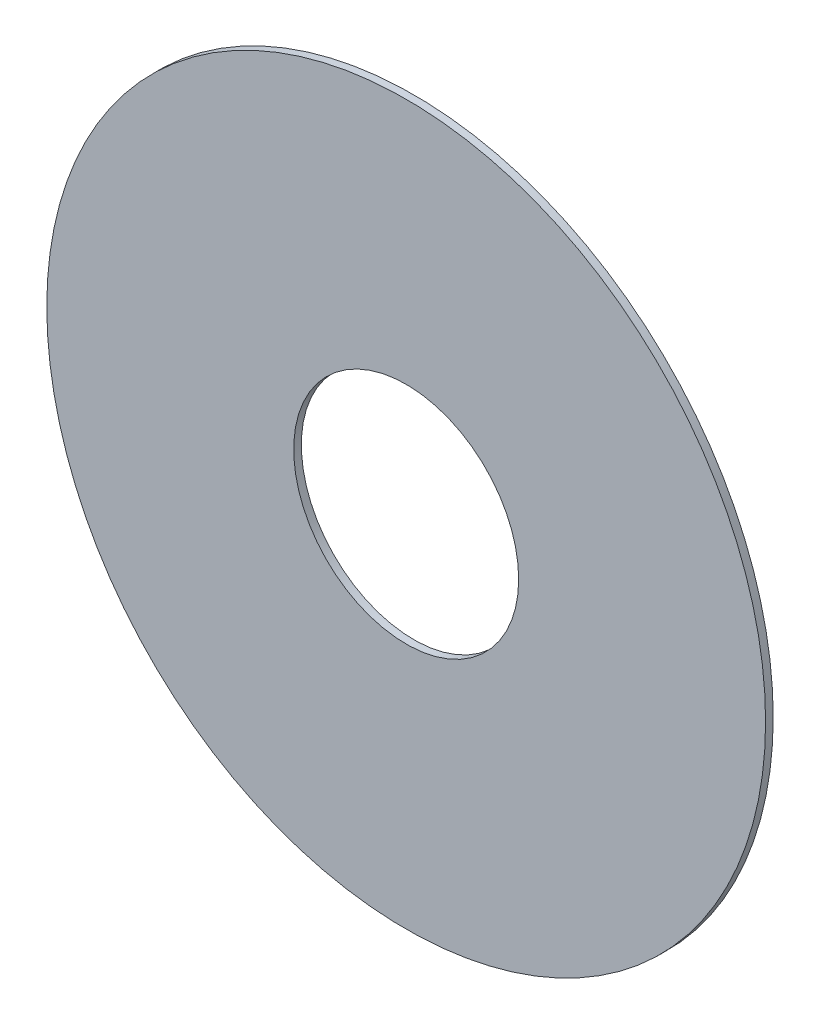
ISO-10303-21;
HEADER;
FILE_DESCRIPTION(('STEP AP214'),'2;1');
FILE_NAME('part.step','',(''),(''),'','','');
FILE_SCHEMA(('AUTOMOTIVE_DESIGN { 1 0 10303 214 1 1 1 1 }'));
ENDSEC;
DATA;
#1=APPLICATION_CONTEXT('core data for automotive mechanical design processes');
#2=APPLICATION_PROTOCOL_DEFINITION('international standard','automotive_design',2000,#1);
#3=PRODUCT_CONTEXT('',#1,'mechanical');
#4=PRODUCT('Part','Part','',(#3));
#5=PRODUCT_RELATED_PRODUCT_CATEGORY('part','',(#4));
#6=PRODUCT_DEFINITION_FORMATION('','',#4);
#7=PRODUCT_DEFINITION_CONTEXT('part definition',#1,'design');
#8=PRODUCT_DEFINITION('design','',#6,#7);
#9=PRODUCT_DEFINITION_SHAPE('','',#8);
#10=(LENGTH_UNIT() NAMED_UNIT(*) SI_UNIT(.MILLI.,.METRE.));
#11=(NAMED_UNIT(*) PLANE_ANGLE_UNIT() SI_UNIT($,.RADIAN.));
#12=(NAMED_UNIT(*) SI_UNIT($,.STERADIAN.) SOLID_ANGLE_UNIT());
#13=UNCERTAINTY_MEASURE_WITH_UNIT(LENGTH_MEASURE(1.E-05),#10,'distance_accuracy_value','');
#14=(GEOMETRIC_REPRESENTATION_CONTEXT(3) GLOBAL_UNCERTAINTY_ASSIGNED_CONTEXT((#13)) GLOBAL_UNIT_ASSIGNED_CONTEXT((#10,
#11,#12)) REPRESENTATION_CONTEXT('',''));
#15=CARTESIAN_POINT('',(0.,0.,0.));
#16=DIRECTION('',(0.,0.,1.));
#17=DIRECTION('',(1.,0.,0.));
#18=AXIS2_PLACEMENT_3D('',#15,#16,#17);
#19=CARTESIAN_POINT('',(0.,0.,47.5));
#20=DIRECTION('',(0.,0.,1.));
#21=DIRECTION('',(1.,0.,0.));
#22=AXIS2_PLACEMENT_3D('',#19,#20,#21);
#23=PLANE('',#22);
#24=CARTESIAN_POINT('',(0.,0.,47.5));
#25=DIRECTION('',(0.,0.,1.));
#26=DIRECTION('',(1.,0.,0.));
#27=AXIS2_PLACEMENT_3D('',#24,#25,#26);
#28=CIRCLE('',#27,94.2461538461538);
#29=CARTESIAN_POINT('',(94.2461538461538,0.,47.5));
#30=VERTEX_POINT('',#29);
#31=EDGE_CURVE('E10',#30,#30,#28,.T.);
#32=ORIENTED_EDGE('',*,*,#31,.T.);
#33=EDGE_LOOP('',(#32));
#34=FACE_BOUND('',#33,.T.);
#35=CARTESIAN_POINT('',(0.,0.,47.5));
#36=DIRECTION('',(0.,0.,1.));
#37=DIRECTION('',(1.,0.,0.));
#38=AXIS2_PLACEMENT_3D('',#35,#36,#37);
#39=CIRCLE('',#38,29.5);
#40=CARTESIAN_POINT('',(29.5,0.,47.5));
#41=VERTEX_POINT('',#40);
#42=EDGE_CURVE('E46',#41,#41,#39,.T.);
#43=ORIENTED_EDGE('',*,*,#42,.F.);
#44=EDGE_LOOP('',(#43));
#45=FACE_BOUND('',#44,.T.);
#46=ADVANCED_FACE('F35',(#34,#45),#23,.T.);
#47=CARTESIAN_POINT('',(0.,0.,45.5));
#48=DIRECTION('',(0.,0.,1.));
#49=DIRECTION('',(1.,0.,0.));
#50=AXIS2_PLACEMENT_3D('',#47,#48,#49);
#51=PLANE('',#50);
#52=CARTESIAN_POINT('',(0.,0.,45.5));
#53=DIRECTION('',(0.,0.,1.));
#54=DIRECTION('',(1.,0.,0.));
#55=AXIS2_PLACEMENT_3D('',#52,#53,#54);
#56=CIRCLE('',#55,94.2461538461538);
#57=CARTESIAN_POINT('',(94.2461538461538,0.,45.5));
#58=VERTEX_POINT('',#57);
#59=EDGE_CURVE('E39',#58,#58,#56,.T.);
#60=ORIENTED_EDGE('',*,*,#59,.F.);
#61=EDGE_LOOP('',(#60));
#62=FACE_BOUND('',#61,.T.);
#63=CARTESIAN_POINT('',(0.,0.,45.5));
#64=DIRECTION('',(0.,0.,1.));
#65=DIRECTION('',(1.,0.,0.));
#66=AXIS2_PLACEMENT_3D('',#63,#64,#65);
#67=CIRCLE('',#66,29.5);
#68=CARTESIAN_POINT('',(29.5,0.,45.5));
#69=VERTEX_POINT('',#68);
#70=EDGE_CURVE('E48',#69,#69,#67,.T.);
#71=ORIENTED_EDGE('',*,*,#70,.T.);
#72=EDGE_LOOP('',(#71));
#73=FACE_BOUND('',#72,.T.);
#74=ADVANCED_FACE('F58',(#62,#73),#51,.F.);
#75=CARTESIAN_POINT('',(0.,0.,47.5));
#76=DIRECTION('',(0.,0.,-1.));
#77=DIRECTION('',(-1.,0.,0.));
#78=AXIS2_PLACEMENT_3D('',#75,#76,#77);
#79=CYLINDRICAL_SURFACE('',#78,94.2461538461538);
#80=ORIENTED_EDGE('',*,*,#31,.F.);
#81=EDGE_LOOP('',(#80));
#82=FACE_BOUND('',#81,.T.);
#83=ORIENTED_EDGE('',*,*,#59,.T.);
#84=EDGE_LOOP('',(#83));
#85=FACE_BOUND('',#84,.T.);
#86=ADVANCED_FACE('F37',(#82,#85),#79,.T.);
#87=CARTESIAN_POINT('',(0.,0.,47.5));
#88=DIRECTION('',(0.,0.,-1.));
#89=DIRECTION('',(-1.,0.,0.));
#90=AXIS2_PLACEMENT_3D('',#87,#88,#89);
#91=CYLINDRICAL_SURFACE('',#90,29.5);
#92=ORIENTED_EDGE('',*,*,#42,.T.);
#93=EDGE_LOOP('',(#92));
#94=FACE_BOUND('',#93,.T.);
#95=ORIENTED_EDGE('',*,*,#70,.F.);
#96=EDGE_LOOP('',(#95));
#97=FACE_BOUND('',#96,.T.);
#98=ADVANCED_FACE('F54',(#94,#97),#91,.F.);
#99=CLOSED_SHELL('',(#46,#74,#86,#98));
#100=MANIFOLD_SOLID_BREP('B2',#99);
#101=ADVANCED_BREP_SHAPE_REPRESENTATION('',(#18,#100),#14);
#102=SHAPE_DEFINITION_REPRESENTATION(#9,#101);
ENDSEC;
END-ISO-10303-21;
